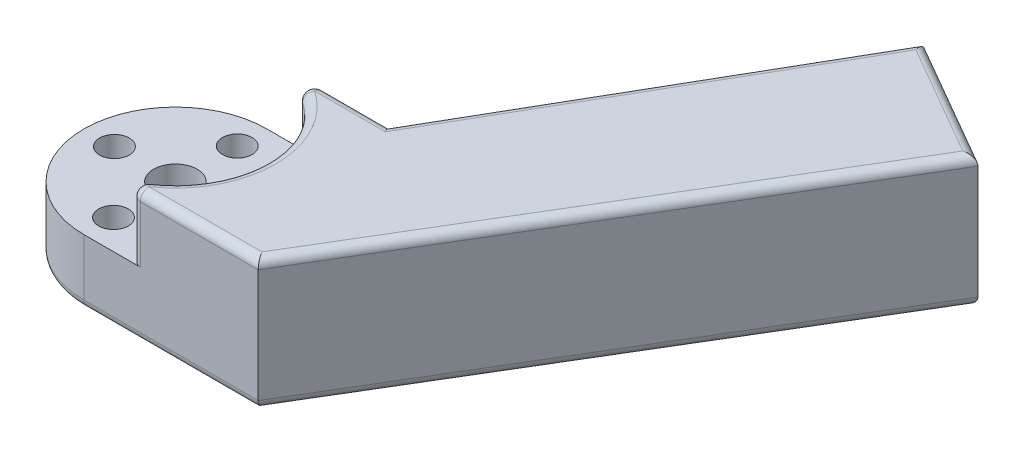
ISO-10303-21;
HEADER;
FILE_DESCRIPTION(('STEP AP214'),'2;1');
FILE_NAME('part.step','',(''),(''),'','','');
FILE_SCHEMA(('AUTOMOTIVE_DESIGN { 1 0 10303 214 1 1 1 1 }'));
ENDSEC;
DATA;
#1=APPLICATION_CONTEXT('core data for automotive mechanical design processes');
#2=APPLICATION_PROTOCOL_DEFINITION('international standard','automotive_design',2000,#1);
#3=PRODUCT_CONTEXT('',#1,'mechanical');
#4=PRODUCT('Part','Part','',(#3));
#5=PRODUCT_RELATED_PRODUCT_CATEGORY('part','',(#4));
#6=PRODUCT_DEFINITION_FORMATION('','',#4);
#7=PRODUCT_DEFINITION_CONTEXT('part definition',#1,'design');
#8=PRODUCT_DEFINITION('design','',#6,#7);
#9=PRODUCT_DEFINITION_SHAPE('','',#8);
#10=(LENGTH_UNIT() NAMED_UNIT(*) SI_UNIT(.MILLI.,.METRE.));
#11=(NAMED_UNIT(*) PLANE_ANGLE_UNIT() SI_UNIT($,.RADIAN.));
#12=(NAMED_UNIT(*) SI_UNIT($,.STERADIAN.) SOLID_ANGLE_UNIT());
#13=UNCERTAINTY_MEASURE_WITH_UNIT(LENGTH_MEASURE(1.E-05),#10,'distance_accuracy_value','');
#14=(GEOMETRIC_REPRESENTATION_CONTEXT(3) GLOBAL_UNCERTAINTY_ASSIGNED_CONTEXT((#13)) GLOBAL_UNIT_ASSIGNED_CONTEXT((#10,
#11,#12)) REPRESENTATION_CONTEXT('',''));
#15=CARTESIAN_POINT('',(0.,0.,0.));
#16=DIRECTION('',(0.,0.,1.));
#17=DIRECTION('',(1.,0.,0.));
#18=AXIS2_PLACEMENT_3D('',#15,#16,#17);
#19=CARTESIAN_POINT('',(0.,15.,0.));
#20=DIRECTION('',(0.,-1.,0.));
#21=DIRECTION('',(0.,0.,-1.));
#22=AXIS2_PLACEMENT_3D('',#19,#20,#21);
#23=CYLINDRICAL_SURFACE('',#22,10.5);
#24=DIRECTION('',(0.,-1.,0.));
#25=VECTOR('',#24,1.);
#26=CARTESIAN_POINT('',(5.91719802898109,15.,8.67391304347827));
#27=LINE('',#26,#25);
#28=CARTESIAN_POINT('',(5.91719802898109,7.5,8.67391304347826));
#29=VERTEX_POINT('',#28);
#30=CARTESIAN_POINT('',(5.91719802898109,14.,8.67391304347827));
#31=VERTEX_POINT('',#30);
#32=EDGE_CURVE('E398',#29,#31,#27,.F.);
#33=ORIENTED_EDGE('',*,*,#32,.T.);
#34=CARTESIAN_POINT('',(0.,14.,0.));
#35=DIRECTION('',(0.,1.,0.));
#36=DIRECTION('',(0.,0.,1.));
#37=AXIS2_PLACEMENT_3D('',#34,#35,#36);
#38=CIRCLE('',#37,10.5);
#39=CARTESIAN_POINT('',(5.91719802898109,14.,-8.67391304347827));
#40=VERTEX_POINT('',#39);
#41=EDGE_CURVE('E47',#31,#40,#38,.T.);
#42=ORIENTED_EDGE('',*,*,#41,.T.);
#43=DIRECTION('',(0.,-1.,0.));
#44=VECTOR('',#43,1.);
#45=CARTESIAN_POINT('',(5.91719802898109,15.,-8.67391304347827));
#46=LINE('',#45,#44);
#47=CARTESIAN_POINT('',(5.91719802898109,7.5,-8.67391304347826));
#48=VERTEX_POINT('',#47);
#49=EDGE_CURVE('E405',#40,#48,#46,.T.);
#50=ORIENTED_EDGE('',*,*,#49,.T.);
#51=CARTESIAN_POINT('',(0.,7.5,0.));
#52=DIRECTION('',(0.,1.,0.));
#53=DIRECTION('',(0.,0.,1.));
#54=AXIS2_PLACEMENT_3D('',#51,#52,#53);
#55=CIRCLE('',#54,10.5);
#56=EDGE_CURVE('E493',#29,#48,#55,.T.);
#57=ORIENTED_EDGE('',*,*,#56,.F.);
#58=EDGE_LOOP('',(#33,#42,#50,#57));
#59=FACE_BOUND('',#58,.T.);
#60=ADVANCED_FACE('F37',(#59),#23,.F.);
#61=CARTESIAN_POINT('',(0.,15.,10.5));
#62=DIRECTION('',(0.,0.,-1.));
#63=DIRECTION('',(-1.,0.,0.));
#64=AXIS2_PLACEMENT_3D('',#61,#62,#63);
#65=PLANE('',#64);
#66=DIRECTION('',(0.,-1.,0.));
#67=VECTOR('',#66,1.);
#68=CARTESIAN_POINT('',(0.,7.5,10.5));
#69=LINE('',#68,#67);
#70=CARTESIAN_POINT('',(0.,1.,10.5));
#71=VERTEX_POINT('',#70);
#72=CARTESIAN_POINT('',(0.,7.5,10.5));
#73=VERTEX_POINT('',#72);
#74=EDGE_CURVE('E84',#71,#73,#69,.F.);
#75=ORIENTED_EDGE('',*,*,#74,.F.);
#76=DIRECTION('',(1.,0.,0.));
#77=VECTOR('',#76,1.);
#78=CARTESIAN_POINT('',(0.,1.,10.5));
#79=LINE('',#78,#77);
#80=CARTESIAN_POINT('',(20.,1.,10.5));
#81=VERTEX_POINT('',#80);
#82=EDGE_CURVE('E463',#71,#81,#79,.T.);
#83=ORIENTED_EDGE('',*,*,#82,.T.);
#84=DIRECTION('',(0.,-1.,0.));
#85=VECTOR('',#84,1.);
#86=CARTESIAN_POINT('',(20.,15.,10.5));
#87=LINE('',#86,#85);
#88=CARTESIAN_POINT('',(20.,14.,10.5));
#89=VERTEX_POINT('',#88);
#90=EDGE_CURVE('E392',#89,#81,#87,.T.);
#91=ORIENTED_EDGE('',*,*,#90,.F.);
#92=DIRECTION('',(1.,0.,0.));
#93=VECTOR('',#92,1.);
#94=CARTESIAN_POINT('',(6.48074069840786,14.,10.5));
#95=LINE('',#94,#93);
#96=CARTESIAN_POINT('',(6.48074069840786,14.,10.5));
#97=VERTEX_POINT('',#96);
#98=EDGE_CURVE('E461',#89,#97,#95,.F.);
#99=ORIENTED_EDGE('',*,*,#98,.T.);
#100=DIRECTION('',(0.,1.,0.));
#101=VECTOR('',#100,1.);
#102=CARTESIAN_POINT('',(6.48074069840786,7.5,10.5));
#103=LINE('',#102,#101);
#104=CARTESIAN_POINT('',(6.48074069840786,7.5,10.5));
#105=VERTEX_POINT('',#104);
#106=EDGE_CURVE('E415',#97,#105,#103,.F.);
#107=ORIENTED_EDGE('',*,*,#106,.T.);
#108=DIRECTION('',(-1.,0.,0.));
#109=VECTOR('',#108,1.);
#110=CARTESIAN_POINT('',(0.,7.5,10.5));
#111=LINE('',#110,#109);
#112=EDGE_CURVE('E413',#105,#73,#111,.T.);
#113=ORIENTED_EDGE('',*,*,#112,.T.);
#114=EDGE_LOOP('',(#75,#83,#91,#99,#107,#113));
#115=FACE_BOUND('',#114,.T.);
#116=ADVANCED_FACE('F345',(#115),#65,.F.);
#117=CARTESIAN_POINT('',(19.3301904903682,15.,11.6147502239634));
#118=DIRECTION('',(0.85716730070211,0.,0.515038074910058));
#119=DIRECTION('',(0.515038074910058,0.,-0.85716730070211));
#120=AXIS2_PLACEMENT_3D('',#117,#118,#119);
#121=PLANE('',#120);
#122=ORIENTED_EDGE('',*,*,#90,.T.);
#123=DIRECTION('',(-0.515038074910058,0.,0.85716730070211));
#124=VECTOR('',#123,1.);
#125=CARTESIAN_POINT('',(51.0030782577631,1.,-41.0977870341021));
#126=LINE('',#125,#124);
#127=CARTESIAN_POINT('',(51.0030782577631,1.,-41.0977870341021));
#128=VERTEX_POINT('',#127);
#129=EDGE_CURVE('E372',#81,#128,#126,.F.);
#130=ORIENTED_EDGE('',*,*,#129,.T.);
#131=DIRECTION('',(0.,-1.,0.));
#132=VECTOR('',#131,1.);
#133=CARTESIAN_POINT('',(51.0030782577631,15.,-41.0977870341021));
#134=LINE('',#133,#132);
#135=CARTESIAN_POINT('',(51.0030782577631,14.,-41.0977870341021));
#136=VERTEX_POINT('',#135);
#137=EDGE_CURVE('E389',#136,#128,#134,.T.);
#138=ORIENTED_EDGE('',*,*,#137,.F.);
#139=DIRECTION('',(-0.515038074910058,0.,0.85716730070211));
#140=VECTOR('',#139,1.);
#141=CARTESIAN_POINT('',(19.3301904903682,14.,11.6147502239634));
#142=LINE('',#141,#140);
#143=EDGE_CURVE('E393',#136,#89,#142,.T.);
#144=ORIENTED_EDGE('',*,*,#143,.T.);
#145=EDGE_LOOP('',(#122,#130,#138,#144));
#146=FACE_BOUND('',#145,.T.);
#147=ADVANCED_FACE('F350',(#146),#121,.T.);
#148=CARTESIAN_POINT('',(30.5466333698682,15.,-52.9083209967909));
#149=DIRECTION('',(0.499999999999998,0.,-0.86602540378444));
#150=DIRECTION('',(-0.86602540378444,0.,-0.499999999999998));
#151=AXIS2_PLACEMENT_3D('',#148,#149,#150);
#152=PLANE('',#151);
#153=ORIENTED_EDGE('',*,*,#137,.T.);
#154=DIRECTION('',(0.86602540378444,0.,0.499999999999998));
#155=VECTOR('',#154,1.);
#156=CARTESIAN_POINT('',(36.4999999999999,1.,-49.4711431702998));
#157=LINE('',#156,#155);
#158=CARTESIAN_POINT('',(36.4999999999999,1.,-49.4711431702998));
#159=VERTEX_POINT('',#158);
#160=EDGE_CURVE('E378',#128,#159,#157,.F.);
#161=ORIENTED_EDGE('',*,*,#160,.T.);
#162=DIRECTION('',(0.,-1.,0.));
#163=VECTOR('',#162,1.);
#164=CARTESIAN_POINT('',(36.4999999999999,15.,-49.4711431702998));
#165=LINE('',#164,#163);
#166=CARTESIAN_POINT('',(36.4999999999999,14.,-49.4711431702998));
#167=VERTEX_POINT('',#166);
#168=EDGE_CURVE('E396',#167,#159,#165,.T.);
#169=ORIENTED_EDGE('',*,*,#168,.F.);
#170=DIRECTION('',(0.86602540378444,0.,0.499999999999998));
#171=VECTOR('',#170,1.);
#172=CARTESIAN_POINT('',(30.5466333698682,14.,-52.9083209967909));
#173=LINE('',#172,#171);
#174=EDGE_CURVE('E210',#167,#136,#173,.T.);
#175=ORIENTED_EDGE('',*,*,#174,.T.);
#176=EDGE_LOOP('',(#153,#161,#169,#175));
#177=FACE_BOUND('',#176,.T.);
#178=ADVANCED_FACE('F395',(#177),#152,.T.);
#179=CARTESIAN_POINT('',(5.95336663013174,15.,3.43717782649108));
#180=DIRECTION('',(-0.86602540378444,0.,-0.499999999999998));
#181=DIRECTION('',(-0.499999999999998,0.,0.86602540378444));
#182=AXIS2_PLACEMENT_3D('',#179,#180,#181);
#183=PLANE('',#182);
#184=ORIENTED_EDGE('',*,*,#168,.T.);
#185=DIRECTION('',(0.499999999999998,0.,-0.86602540378444));
#186=VECTOR('',#185,1.);
#187=CARTESIAN_POINT('',(14.,1.,-10.5));
#188=LINE('',#187,#186);
#189=CARTESIAN_POINT('',(14.,1.,-10.5));
#190=VERTEX_POINT('',#189);
#191=EDGE_CURVE('E453',#159,#190,#188,.F.);
#192=ORIENTED_EDGE('',*,*,#191,.T.);
#193=DIRECTION('',(0.,-1.,0.));
#194=VECTOR('',#193,1.);
#195=CARTESIAN_POINT('',(14.,15.,-10.5));
#196=LINE('',#195,#194);
#197=CARTESIAN_POINT('',(14.,14.,-10.5));
#198=VERTEX_POINT('',#197);
#199=EDGE_CURVE('E400',#198,#190,#196,.T.);
#200=ORIENTED_EDGE('',*,*,#199,.F.);
#201=DIRECTION('',(0.499999999999998,0.,-0.86602540378444));
#202=VECTOR('',#201,1.);
#203=CARTESIAN_POINT('',(5.95336663013174,14.,3.43717782649108));
#204=LINE('',#203,#202);
#205=EDGE_CURVE('E384',#198,#167,#204,.T.);
#206=ORIENTED_EDGE('',*,*,#205,.T.);
#207=EDGE_LOOP('',(#184,#192,#200,#206));
#208=FACE_BOUND('',#207,.T.);
#209=ADVANCED_FACE('F577',(#208),#183,.T.);
#210=CARTESIAN_POINT('',(0.,15.,-10.5));
#211=DIRECTION('',(0.,0.,-1.));
#212=DIRECTION('',(-1.,0.,0.));
#213=AXIS2_PLACEMENT_3D('',#210,#211,#212);
#214=PLANE('',#213);
#215=ORIENTED_EDGE('',*,*,#199,.T.);
#216=DIRECTION('',(1.,0.,0.));
#217=VECTOR('',#216,1.);
#218=CARTESIAN_POINT('',(0.,1.,-10.5));
#219=LINE('',#218,#217);
#220=CARTESIAN_POINT('',(0.,1.,-10.5));
#221=VERTEX_POINT('',#220);
#222=EDGE_CURVE('E457',#190,#221,#219,.F.);
#223=ORIENTED_EDGE('',*,*,#222,.T.);
#224=DIRECTION('',(0.,-1.,0.));
#225=VECTOR('',#224,1.);
#226=CARTESIAN_POINT('',(0.,7.5,-10.5));
#227=LINE('',#226,#225);
#228=CARTESIAN_POINT('',(0.,7.5,-10.5));
#229=VERTEX_POINT('',#228);
#230=EDGE_CURVE('E506',#221,#229,#227,.F.);
#231=ORIENTED_EDGE('',*,*,#230,.T.);
#232=DIRECTION('',(1.,0.,0.));
#233=VECTOR('',#232,1.);
#234=CARTESIAN_POINT('',(0.,7.5,-10.5));
#235=LINE('',#234,#233);
#236=CARTESIAN_POINT('',(6.48074069840786,7.5,-10.5));
#237=VERTEX_POINT('',#236);
#238=EDGE_CURVE('E410',#229,#237,#235,.T.);
#239=ORIENTED_EDGE('',*,*,#238,.T.);
#240=DIRECTION('',(0.,-1.,0.));
#241=VECTOR('',#240,1.);
#242=CARTESIAN_POINT('',(6.48074069840786,15.,-10.5));
#243=LINE('',#242,#241);
#244=CARTESIAN_POINT('',(6.48074069840786,14.,-10.5));
#245=VERTEX_POINT('',#244);
#246=EDGE_CURVE('E407',#237,#245,#243,.F.);
#247=ORIENTED_EDGE('',*,*,#246,.T.);
#248=DIRECTION('',(1.,0.,0.));
#249=VECTOR('',#248,1.);
#250=CARTESIAN_POINT('',(0.,14.,-10.5));
#251=LINE('',#250,#249);
#252=EDGE_CURVE('E455',#245,#198,#251,.T.);
#253=ORIENTED_EDGE('',*,*,#252,.T.);
#254=EDGE_LOOP('',(#215,#223,#231,#239,#247,#253));
#255=FACE_BOUND('',#254,.T.);
#256=ADVANCED_FACE('F502',(#255),#214,.T.);
#257=CARTESIAN_POINT('',(0.,15.,0.));
#258=DIRECTION('',(0.,1.,0.));
#259=DIRECTION('',(0.,0.,1.));
#260=AXIS2_PLACEMENT_3D('',#257,#258,#259);
#261=PLANE('',#260);
#262=DIRECTION('',(0.86602540378444,0.,0.499999999999998));
#263=VECTOR('',#262,1.);
#264=CARTESIAN_POINT('',(30.0466333698682,15.,-52.0422955930064));
#265=LINE('',#264,#263);
#266=CARTESIAN_POINT('',(49.6218044043704,15.,-40.7405653268037));
#267=VERTEX_POINT('',#266);
#268=CARTESIAN_POINT('',(36.8660254037843,15.,-48.1051177665154));
#269=VERTEX_POINT('',#268);
#270=EDGE_CURVE('E188',#267,#269,#265,.F.);
#271=ORIENTED_EDGE('',*,*,#270,.T.);
#272=DIRECTION('',(0.499999999999998,0.,-0.86602540378444));
#273=VECTOR('',#272,1.);
#274=CARTESIAN_POINT('',(6.81939203391618,15.,3.93717782649107));
#275=LINE('',#274,#273);
#276=CARTESIAN_POINT('',(14.5773502691896,15.,-9.5));
#277=VERTEX_POINT('',#276);
#278=EDGE_CURVE('E191',#269,#277,#275,.F.);
#279=ORIENTED_EDGE('',*,*,#278,.T.);
#280=DIRECTION('',(1.,0.,0.));
#281=VECTOR('',#280,1.);
#282=CARTESIAN_POINT('',(0.,15.,-9.5));
#283=LINE('',#282,#281);
#284=CARTESIAN_POINT('',(6.48074069840786,15.,-9.5));
#285=VERTEX_POINT('',#284);
#286=EDGE_CURVE('E480',#277,#285,#283,.F.);
#287=ORIENTED_EDGE('',*,*,#286,.T.);
#288=CARTESIAN_POINT('',(0.,15.,0.));
#289=DIRECTION('',(0.,1.,0.));
#290=DIRECTION('',(0.,0.,1.));
#291=AXIS2_PLACEMENT_3D('',#288,#289,#290);
#292=CIRCLE('',#291,11.5);
#293=CARTESIAN_POINT('',(6.48074069840786,15.,9.5));
#294=VERTEX_POINT('',#293);
#295=EDGE_CURVE('E482',#285,#294,#292,.F.);
#296=ORIENTED_EDGE('',*,*,#295,.T.);
#297=DIRECTION('',(1.,0.,0.));
#298=VECTOR('',#297,1.);
#299=CARTESIAN_POINT('',(20.,15.,9.5));
#300=LINE('',#299,#298);
#301=CARTESIAN_POINT('',(19.4342272218122,15.,9.5));
#302=VERTEX_POINT('',#301);
#303=EDGE_CURVE('E484',#294,#302,#300,.T.);
#304=ORIENTED_EDGE('',*,*,#303,.T.);
#305=DIRECTION('',(-0.515038074910058,0.,0.85716730070211));
#306=VECTOR('',#305,1.);
#307=CARTESIAN_POINT('',(18.4730231896661,15.,11.0997121490534));
#308=LINE('',#307,#306);
#309=EDGE_CURVE('E193',#302,#267,#308,.F.);
#310=ORIENTED_EDGE('',*,*,#309,.T.);
#311=EDGE_LOOP('',(#271,#279,#287,#296,#304,#310));
#312=FACE_BOUND('',#311,.T.);
#313=ADVANCED_FACE('F190',(#312),#261,.T.);
#314=CARTESIAN_POINT('',(0.,0.,0.));
#315=DIRECTION('',(0.,1.,0.));
#316=DIRECTION('',(0.,0.,1.));
#317=AXIS2_PLACEMENT_3D('',#314,#315,#316);
#318=PLANE('',#317);
#319=CARTESIAN_POINT('',(0.,0.,0.));
#320=DIRECTION('',(0.,1.,0.));
#321=DIRECTION('',(0.,0.,1.));
#322=AXIS2_PLACEMENT_3D('',#319,#320,#321);
#323=CIRCLE('',#322,3.5);
#324=CARTESIAN_POINT('',(0.,0.,3.5));
#325=VERTEX_POINT('',#324);
#326=EDGE_CURVE('E447',#325,#325,#323,.T.);
#327=ORIENTED_EDGE('',*,*,#326,.T.);
#328=EDGE_LOOP('',(#327));
#329=FACE_BOUND('',#328,.T.);
#330=CARTESIAN_POINT('',(7.2,0.,0.));
#331=DIRECTION('',(0.,1.,0.));
#332=DIRECTION('',(0.,0.,1.));
#333=AXIS2_PLACEMENT_3D('',#330,#331,#332);
#334=CIRCLE('',#333,2.7);
#335=CARTESIAN_POINT('',(7.2,0.,2.7));
#336=VERTEX_POINT('',#335);
#337=EDGE_CURVE('E444',#336,#336,#334,.T.);
#338=ORIENTED_EDGE('',*,*,#337,.T.);
#339=EDGE_LOOP('',(#338));
#340=FACE_BOUND('',#339,.T.);
#341=DIRECTION('',(1.,0.,0.));
#342=VECTOR('',#341,1.);
#343=CARTESIAN_POINT('',(0.,0.,9.5));
#344=LINE('',#343,#342);
#345=CARTESIAN_POINT('',(19.4342272218122,0.,9.5));
#346=VERTEX_POINT('',#345);
#347=CARTESIAN_POINT('',(1.2369316876853,0.,9.5));
#348=VERTEX_POINT('',#347);
#349=EDGE_CURVE('E438',#346,#348,#344,.F.);
#350=ORIENTED_EDGE('',*,*,#349,.T.);
#351=CARTESIAN_POINT('',(0.,0.,7.1));
#352=DIRECTION('',(0.,1.,0.));
#353=DIRECTION('',(0.,0.,1.));
#354=AXIS2_PLACEMENT_3D('',#351,#352,#353);
#355=CIRCLE('',#354,2.7);
#356=CARTESIAN_POINT('',(-1.426735362596,0.,9.39225352112677));
#357=VERTEX_POINT('',#356);
#358=EDGE_CURVE('E442',#348,#357,#355,.T.);
#359=ORIENTED_EDGE('',*,*,#358,.T.);
#360=CARTESIAN_POINT('',(0.,0.,0.));
#361=DIRECTION('',(0.,1.,0.));
#362=DIRECTION('',(0.,0.,1.));
#363=AXIS2_PLACEMENT_3D('',#360,#361,#362);
#364=CIRCLE('',#363,9.5);
#365=CARTESIAN_POINT('',(-9.42571428571429,0.,1.18571084336849));
#366=VERTEX_POINT('',#365);
#367=EDGE_CURVE('E440',#357,#366,#364,.F.);
#368=ORIENTED_EDGE('',*,*,#367,.T.);
#369=CARTESIAN_POINT('',(-7.,0.,0.));
#370=DIRECTION('',(0.,1.,0.));
#371=DIRECTION('',(0.,0.,1.));
#372=AXIS2_PLACEMENT_3D('',#369,#370,#371);
#373=CIRCLE('',#372,2.7);
#374=CARTESIAN_POINT('',(-7.,0.,2.7));
#375=VERTEX_POINT('',#374);
#376=EDGE_CURVE('E436',#366,#375,#373,.T.);
#377=ORIENTED_EDGE('',*,*,#376,.T.);
#378=CARTESIAN_POINT('',(-7.,0.,0.));
#379=DIRECTION('',(0.,1.,0.));
#380=DIRECTION('',(0.,0.,1.));
#381=AXIS2_PLACEMENT_3D('',#378,#379,#380);
#382=CIRCLE('',#381,2.7);
#383=CARTESIAN_POINT('',(-9.42571428571429,0.,-1.18571084336849));
#384=VERTEX_POINT('',#383);
#385=EDGE_CURVE('E434',#375,#384,#382,.T.);
#386=ORIENTED_EDGE('',*,*,#385,.T.);
#387=CARTESIAN_POINT('',(0.,0.,0.));
#388=DIRECTION('',(0.,1.,0.));
#389=DIRECTION('',(0.,0.,1.));
#390=AXIS2_PLACEMENT_3D('',#387,#388,#389);
#391=CIRCLE('',#390,9.5);
#392=CARTESIAN_POINT('',(-1.426735362596,0.,-9.39225352112676));
#393=VERTEX_POINT('',#392);
#394=EDGE_CURVE('E425',#384,#393,#391,.F.);
#395=ORIENTED_EDGE('',*,*,#394,.T.);
#396=CARTESIAN_POINT('',(0.,0.,-7.1));
#397=DIRECTION('',(0.,1.,0.));
#398=DIRECTION('',(0.,0.,1.));
#399=AXIS2_PLACEMENT_3D('',#396,#397,#398);
#400=CIRCLE('',#399,2.7);
#401=CARTESIAN_POINT('',(0.,0.,-4.4));
#402=VERTEX_POINT('',#401);
#403=EDGE_CURVE('E423',#393,#402,#400,.T.);
#404=ORIENTED_EDGE('',*,*,#403,.T.);
#405=CARTESIAN_POINT('',(0.,0.,-7.1));
#406=DIRECTION('',(0.,1.,0.));
#407=DIRECTION('',(0.,0.,1.));
#408=AXIS2_PLACEMENT_3D('',#405,#406,#407);
#409=CIRCLE('',#408,2.7);
#410=CARTESIAN_POINT('',(1.23693168768529,0.,-9.5));
#411=VERTEX_POINT('',#410);
#412=EDGE_CURVE('E421',#402,#411,#409,.T.);
#413=ORIENTED_EDGE('',*,*,#412,.T.);
#414=DIRECTION('',(1.,0.,0.));
#415=VECTOR('',#414,1.);
#416=CARTESIAN_POINT('',(14.,0.,-9.5));
#417=LINE('',#416,#415);
#418=CARTESIAN_POINT('',(14.5773502691896,0.,-9.5));
#419=VERTEX_POINT('',#418);
#420=EDGE_CURVE('E427',#411,#419,#417,.T.);
#421=ORIENTED_EDGE('',*,*,#420,.T.);
#422=DIRECTION('',(0.499999999999998,0.,-0.86602540378444));
#423=VECTOR('',#422,1.);
#424=CARTESIAN_POINT('',(37.3660254037843,0.,-48.9711431702998));
#425=LINE('',#424,#423);
#426=CARTESIAN_POINT('',(36.8660254037843,0.,-48.1051177665154));
#427=VERTEX_POINT('',#426);
#428=EDGE_CURVE('E429',#419,#427,#425,.T.);
#429=ORIENTED_EDGE('',*,*,#428,.T.);
#430=DIRECTION('',(0.86602540378444,0.,0.499999999999998));
#431=VECTOR('',#430,1.);
#432=CARTESIAN_POINT('',(50.5030782577631,0.,-40.2317616303176));
#433=LINE('',#432,#431);
#434=CARTESIAN_POINT('',(49.6218044043704,0.,-40.7405653268037));
#435=VERTEX_POINT('',#434);
#436=EDGE_CURVE('E431',#427,#435,#433,.T.);
#437=ORIENTED_EDGE('',*,*,#436,.T.);
#438=DIRECTION('',(-0.515038074910058,0.,0.85716730070211));
#439=VECTOR('',#438,1.);
#440=CARTESIAN_POINT('',(19.1428326992979,0.,9.98496192508994));
#441=LINE('',#440,#439);
#442=EDGE_CURVE('E374',#435,#346,#441,.T.);
#443=ORIENTED_EDGE('',*,*,#442,.T.);
#444=EDGE_LOOP('',(#350,#359,#368,#377,#386,#395,#404,#413,#421,#429,#437,#443));
#445=FACE_BOUND('',#444,.T.);
#446=ADVANCED_FACE('F569',(#329,#340,#445),#318,.F.);
#447=CARTESIAN_POINT('',(0.,7.5,0.));
#448=DIRECTION('',(0.,-1.,0.));
#449=DIRECTION('',(0.,0.,-1.));
#450=AXIS2_PLACEMENT_3D('',#447,#448,#449);
#451=CYLINDRICAL_SURFACE('',#450,10.5);
#452=ORIENTED_EDGE('',*,*,#230,.F.);
#453=CARTESIAN_POINT('',(0.,1.,0.));
#454=DIRECTION('',(0.,1.,0.));
#455=DIRECTION('',(0.,0.,1.));
#456=AXIS2_PLACEMENT_3D('',#453,#454,#455);
#457=CIRCLE('',#456,10.5);
#458=EDGE_CURVE('E459',#221,#71,#457,.T.);
#459=ORIENTED_EDGE('',*,*,#458,.T.);
#460=ORIENTED_EDGE('',*,*,#74,.T.);
#461=EDGE_CURVE('E510',#229,#73,#55,.T.);
#462=ORIENTED_EDGE('',*,*,#461,.F.);
#463=EDGE_LOOP('',(#452,#459,#460,#462));
#464=FACE_BOUND('',#463,.T.);
#465=ADVANCED_FACE('F511',(#464),#451,.T.);
#466=CARTESIAN_POINT('',(0.,7.5,0.));
#467=DIRECTION('',(0.,1.,0.));
#468=DIRECTION('',(0.,0.,1.));
#469=AXIS2_PLACEMENT_3D('',#466,#467,#468);
#470=PLANE('',#469);
#471=CARTESIAN_POINT('',(0.,7.5,-7.1));
#472=DIRECTION('',(0.,1.,0.));
#473=DIRECTION('',(0.,0.,1.));
#474=AXIS2_PLACEMENT_3D('',#471,#472,#473);
#475=CIRCLE('',#474,1.7);
#476=CARTESIAN_POINT('',(0.,7.5,-5.4));
#477=VERTEX_POINT('',#476);
#478=EDGE_CURVE('E515',#477,#477,#475,.T.);
#479=ORIENTED_EDGE('',*,*,#478,.F.);
#480=EDGE_LOOP('',(#479));
#481=FACE_BOUND('',#480,.T.);
#482=CARTESIAN_POINT('',(0.,7.5,7.1));
#483=DIRECTION('',(0.,1.,0.));
#484=DIRECTION('',(0.,0.,1.));
#485=AXIS2_PLACEMENT_3D('',#482,#483,#484);
#486=CIRCLE('',#485,1.7);
#487=CARTESIAN_POINT('',(0.,7.5,8.8));
#488=VERTEX_POINT('',#487);
#489=EDGE_CURVE('E536',#488,#488,#486,.T.);
#490=ORIENTED_EDGE('',*,*,#489,.F.);
#491=EDGE_LOOP('',(#490));
#492=FACE_BOUND('',#491,.T.);
#493=CARTESIAN_POINT('',(-7.,7.5,0.));
#494=DIRECTION('',(0.,1.,0.));
#495=DIRECTION('',(0.,0.,1.));
#496=AXIS2_PLACEMENT_3D('',#493,#494,#495);
#497=CIRCLE('',#496,1.7);
#498=CARTESIAN_POINT('',(-7.,7.5,1.7));
#499=VERTEX_POINT('',#498);
#500=EDGE_CURVE('E531',#499,#499,#497,.T.);
#501=ORIENTED_EDGE('',*,*,#500,.F.);
#502=EDGE_LOOP('',(#501));
#503=FACE_BOUND('',#502,.T.);
#504=CARTESIAN_POINT('',(7.2,7.5,0.));
#505=DIRECTION('',(0.,1.,0.));
#506=DIRECTION('',(0.,0.,1.));
#507=AXIS2_PLACEMENT_3D('',#504,#505,#506);
#508=CIRCLE('',#507,1.7);
#509=CARTESIAN_POINT('',(7.2,7.5,1.7));
#510=VERTEX_POINT('',#509);
#511=EDGE_CURVE('E529',#510,#510,#508,.T.);
#512=ORIENTED_EDGE('',*,*,#511,.F.);
#513=EDGE_LOOP('',(#512));
#514=FACE_BOUND('',#513,.T.);
#515=CARTESIAN_POINT('',(0.,7.5,0.));
#516=DIRECTION('',(0.,1.,0.));
#517=DIRECTION('',(0.,0.,1.));
#518=AXIS2_PLACEMENT_3D('',#515,#516,#517);
#519=CIRCLE('',#518,2.5);
#520=CARTESIAN_POINT('',(0.,7.5,2.5));
#521=VERTEX_POINT('',#520);
#522=EDGE_CURVE('E512',#521,#521,#519,.T.);
#523=ORIENTED_EDGE('',*,*,#522,.F.);
#524=EDGE_LOOP('',(#523));
#525=FACE_BOUND('',#524,.T.);
#526=ORIENTED_EDGE('',*,*,#461,.T.);
#527=ORIENTED_EDGE('',*,*,#112,.F.);
#528=CARTESIAN_POINT('',(6.48074069840786,7.5,9.5));
#529=DIRECTION('',(0.,1.,0.));
#530=DIRECTION('',(0.,0.,1.));
#531=AXIS2_PLACEMENT_3D('',#528,#529,#530);
#532=CIRCLE('',#531,1.);
#533=EDGE_CURVE('E419',#105,#29,#532,.F.);
#534=ORIENTED_EDGE('',*,*,#533,.T.);
#535=ORIENTED_EDGE('',*,*,#56,.T.);
#536=CARTESIAN_POINT('',(6.48074069840786,7.5,-9.5));
#537=DIRECTION('',(0.,1.,0.));
#538=DIRECTION('',(0.,0.,1.));
#539=AXIS2_PLACEMENT_3D('',#536,#537,#538);
#540=CIRCLE('',#539,1.);
#541=EDGE_CURVE('E417',#48,#237,#540,.F.);
#542=ORIENTED_EDGE('',*,*,#541,.T.);
#543=ORIENTED_EDGE('',*,*,#238,.F.);
#544=EDGE_LOOP('',(#526,#527,#534,#535,#542,#543));
#545=FACE_BOUND('',#544,.T.);
#546=ADVANCED_FACE('F359',(#481,#492,#503,#514,#525,#545),#470,.T.);
#547=CARTESIAN_POINT('',(6.48074069840786,15.,-9.5));
#548=DIRECTION('',(0.,-1.,0.));
#549=DIRECTION('',(0.,0.,-1.));
#550=AXIS2_PLACEMENT_3D('',#547,#548,#549);
#551=CYLINDRICAL_SURFACE('',#550,1.);
#552=ORIENTED_EDGE('',*,*,#49,.F.);
#553=CARTESIAN_POINT('',(6.48074069840786,14.,-9.5));
#554=DIRECTION('',(0.,-1.,0.));
#555=DIRECTION('',(0.,0.,-1.));
#556=AXIS2_PLACEMENT_3D('',#553,#554,#555);
#557=CIRCLE('',#556,1.);
#558=EDGE_CURVE('E11',#40,#245,#557,.T.);
#559=ORIENTED_EDGE('',*,*,#558,.T.);
#560=ORIENTED_EDGE('',*,*,#246,.F.);
#561=ORIENTED_EDGE('',*,*,#541,.F.);
#562=EDGE_LOOP('',(#552,#559,#560,#561));
#563=FACE_BOUND('',#562,.T.);
#564=ADVANCED_FACE('F355',(#563),#551,.T.);
#565=CARTESIAN_POINT('',(6.48074069840786,15.,9.5));
#566=DIRECTION('',(0.,-1.,0.));
#567=DIRECTION('',(0.,0.,-1.));
#568=AXIS2_PLACEMENT_3D('',#565,#566,#567);
#569=CYLINDRICAL_SURFACE('',#568,1.);
#570=ORIENTED_EDGE('',*,*,#106,.F.);
#571=CARTESIAN_POINT('',(6.48074069840786,14.,9.5));
#572=DIRECTION('',(0.,-1.,0.));
#573=DIRECTION('',(0.,0.,-1.));
#574=AXIS2_PLACEMENT_3D('',#571,#572,#573);
#575=CIRCLE('',#574,1.);
#576=EDGE_CURVE('E207',#97,#31,#575,.T.);
#577=ORIENTED_EDGE('',*,*,#576,.T.);
#578=ORIENTED_EDGE('',*,*,#32,.F.);
#579=ORIENTED_EDGE('',*,*,#533,.F.);
#580=EDGE_LOOP('',(#570,#577,#578,#579));
#581=FACE_BOUND('',#580,.T.);
#582=ADVANCED_FACE('F358',(#581),#569,.T.);
#583=CARTESIAN_POINT('',(0.,0.,0.));
#584=DIRECTION('',(0.,1.,0.));
#585=DIRECTION('',(0.,0.,1.));
#586=AXIS2_PLACEMENT_3D('',#583,#584,#585);
#587=CYLINDRICAL_SURFACE('',#586,2.5);
#588=CARTESIAN_POINT('',(0.,1.,0.));
#589=DIRECTION('',(0.,1.,0.));
#590=DIRECTION('',(0.,0.,1.));
#591=AXIS2_PLACEMENT_3D('',#588,#589,#590);
#592=CIRCLE('',#591,2.5);
#593=CARTESIAN_POINT('',(0.,1.,2.5));
#594=VERTEX_POINT('',#593);
#595=EDGE_CURVE('E465',#594,#594,#592,.F.);
#596=ORIENTED_EDGE('',*,*,#595,.T.);
#597=EDGE_LOOP('',(#596));
#598=FACE_BOUND('',#597,.T.);
#599=ORIENTED_EDGE('',*,*,#522,.T.);
#600=EDGE_LOOP('',(#599));
#601=FACE_BOUND('',#600,.T.);
#602=ADVANCED_FACE('F362',(#598,#601),#587,.F.);
#603=CARTESIAN_POINT('',(7.2,0.,0.));
#604=DIRECTION('',(0.,1.,0.));
#605=DIRECTION('',(0.,0.,1.));
#606=AXIS2_PLACEMENT_3D('',#603,#604,#605);
#607=CYLINDRICAL_SURFACE('',#606,1.7);
#608=CARTESIAN_POINT('',(7.2,1.,0.));
#609=DIRECTION('',(0.,1.,0.));
#610=DIRECTION('',(0.,0.,1.));
#611=AXIS2_PLACEMENT_3D('',#608,#609,#610);
#612=CIRCLE('',#611,1.7);
#613=CARTESIAN_POINT('',(7.2,1.,1.7));
#614=VERTEX_POINT('',#613);
#615=EDGE_CURVE('E468',#614,#614,#612,.F.);
#616=ORIENTED_EDGE('',*,*,#615,.T.);
#617=EDGE_LOOP('',(#616));
#618=FACE_BOUND('',#617,.T.);
#619=ORIENTED_EDGE('',*,*,#511,.T.);
#620=EDGE_LOOP('',(#619));
#621=FACE_BOUND('',#620,.T.);
#622=ADVANCED_FACE('F555',(#618,#621),#607,.F.);
#623=CARTESIAN_POINT('',(-7.,0.,0.));
#624=DIRECTION('',(0.,1.,0.));
#625=DIRECTION('',(0.,0.,1.));
#626=AXIS2_PLACEMENT_3D('',#623,#624,#625);
#627=CYLINDRICAL_SURFACE('',#626,1.7);
#628=CARTESIAN_POINT('',(-7.,1.,0.));
#629=DIRECTION('',(0.,1.,0.));
#630=DIRECTION('',(0.,0.,1.));
#631=AXIS2_PLACEMENT_3D('',#628,#629,#630);
#632=CIRCLE('',#631,1.7);
#633=CARTESIAN_POINT('',(-7.,1.,1.7));
#634=VERTEX_POINT('',#633);
#635=EDGE_CURVE('E471',#634,#634,#632,.F.);
#636=ORIENTED_EDGE('',*,*,#635,.T.);
#637=EDGE_LOOP('',(#636));
#638=FACE_BOUND('',#637,.T.);
#639=ORIENTED_EDGE('',*,*,#500,.T.);
#640=EDGE_LOOP('',(#639));
#641=FACE_BOUND('',#640,.T.);
#642=ADVANCED_FACE('F561',(#638,#641),#627,.F.);
#643=CARTESIAN_POINT('',(0.,0.,7.1));
#644=DIRECTION('',(0.,1.,0.));
#645=DIRECTION('',(0.,0.,1.));
#646=AXIS2_PLACEMENT_3D('',#643,#644,#645);
#647=CYLINDRICAL_SURFACE('',#646,1.7);
#648=CARTESIAN_POINT('',(0.,1.,7.1));
#649=DIRECTION('',(0.,1.,0.));
#650=DIRECTION('',(0.,0.,1.));
#651=AXIS2_PLACEMENT_3D('',#648,#649,#650);
#652=CIRCLE('',#651,1.7);
#653=CARTESIAN_POINT('',(0.,1.,8.8));
#654=VERTEX_POINT('',#653);
#655=EDGE_CURVE('E474',#654,#654,#652,.F.);
#656=ORIENTED_EDGE('',*,*,#655,.T.);
#657=EDGE_LOOP('',(#656));
#658=FACE_BOUND('',#657,.T.);
#659=ORIENTED_EDGE('',*,*,#489,.T.);
#660=EDGE_LOOP('',(#659));
#661=FACE_BOUND('',#660,.T.);
#662=ADVANCED_FACE('F543',(#658,#661),#647,.F.);
#663=CARTESIAN_POINT('',(0.,0.,-7.1));
#664=DIRECTION('',(0.,1.,0.));
#665=DIRECTION('',(0.,0.,1.));
#666=AXIS2_PLACEMENT_3D('',#663,#664,#665);
#667=CYLINDRICAL_SURFACE('',#666,1.7);
#668=CARTESIAN_POINT('',(0.,1.,-7.1));
#669=DIRECTION('',(0.,1.,0.));
#670=DIRECTION('',(0.,0.,1.));
#671=AXIS2_PLACEMENT_3D('',#668,#669,#670);
#672=CIRCLE('',#671,1.7);
#673=CARTESIAN_POINT('',(0.,1.,-5.4));
#674=VERTEX_POINT('',#673);
#675=EDGE_CURVE('E477',#674,#674,#672,.F.);
#676=ORIENTED_EDGE('',*,*,#675,.T.);
#677=EDGE_LOOP('',(#676));
#678=FACE_BOUND('',#677,.T.);
#679=ORIENTED_EDGE('',*,*,#478,.T.);
#680=EDGE_LOOP('',(#679));
#681=FACE_BOUND('',#680,.T.);
#682=ADVANCED_FACE('F650',(#678,#681),#667,.F.);
#683=CARTESIAN_POINT('',(-7.,1.,0.));
#684=DIRECTION('',(0.,1.,0.));
#685=DIRECTION('',(0.,0.,1.));
#686=AXIS2_PLACEMENT_3D('',#683,#684,#685);
#687=TOROIDAL_SURFACE('',#686,2.7,1.);
#688=ORIENTED_EDGE('',*,*,#635,.F.);
#689=EDGE_LOOP('',(#688));
#690=FACE_BOUND('',#689,.T.);
#691=ORIENTED_EDGE('',*,*,#385,.F.);
#692=ORIENTED_EDGE('',*,*,#376,.F.);
#693=CARTESIAN_POINT('',(-9.42571428571429,0.,-1.18571084336849));
#694=CARTESIAN_POINT('',(-9.42677367004423,9.23224772458515E-09,-1.18215946570751));
#695=CARTESIAN_POINT('',(-9.42782843151688,5.6287321504477E-07,-1.17860664725741));
#696=CARTESIAN_POINT('',(-9.4619304420595,3.5806084510276E-05,-1.06318598747334));
#697=CARTESIAN_POINT('',(-9.49039615613415,0.000596607167344211,-0.949906085339717));
#698=CARTESIAN_POINT('',(-9.53775106770174,0.00197533045128137,-0.721303185648277));
#699=CARTESIAN_POINT('',(-9.55663325440732,0.00279344017881744,-0.605978756068242));
#700=CARTESIAN_POINT('',(-9.58456164578636,0.00412908357724822,-0.373896756757007));
#701=CARTESIAN_POINT('',(-9.59358820454426,0.00464601593753052,-0.257136792015374));
#702=CARTESIAN_POINT('',(-9.6016047781034,0.00510383706487622,-0.0233307090338901));
#703=CARTESIAN_POINT('',(-9.60059896083834,0.00504496504909464,0.0937152701781491));
#704=CARTESIAN_POINT('',(-9.58616391518338,0.00422944488750656,0.373939126792653));
#705=CARTESIAN_POINT('',(-9.56793686232731,0.00320369995639747,0.536885683053529));
#706=CARTESIAN_POINT('',(-9.51239826257325,0.00111348943341214,0.859171322868347));
#707=CARTESIAN_POINT('',(-9.47512787404742,4.91119280250543E-05,1.01851741570737));
#708=CARTESIAN_POINT('',(-9.42782843115661,5.70439053990609E-07,1.17860666966508));
#709=CARTESIAN_POINT('',(-9.42677366978115,1.70090855312876E-08,1.18215948811422));
#710=CARTESIAN_POINT('',(-9.42571428571429,0.,1.18571084336849));
#711=B_SPLINE_CURVE_WITH_KNOTS('',3,(#693,#694,#695,#696,#697,#698,#699,#700,#701,#702,#703,
#704,#705,#706,#707,#708,#709,#710),.UNSPECIFIED.,.F.,.F.,(4,2,2,2,2,2,2,2,4),(0.,
0.0111182296149242,0.361053691759461,0.711244780006514,1.06213266145705,1.41287477320243,
1.90359348828889,2.39325607095082,2.40437430056685),.UNSPECIFIED.);
#712=EDGE_CURVE('E288',#384,#366,#711,.T.);
#713=ORIENTED_EDGE('',*,*,#712,.F.);
#714=EDGE_LOOP('',(#691,#692,#713));
#715=FACE_BOUND('',#714,.T.);
#716=ADVANCED_FACE('F298',(#690,#715),#687,.T.);
#717=CARTESIAN_POINT('',(0.,1.,-7.1));
#718=DIRECTION('',(0.,1.,0.));
#719=DIRECTION('',(0.,0.,1.));
#720=AXIS2_PLACEMENT_3D('',#717,#718,#719);
#721=TOROIDAL_SURFACE('',#720,2.7,1.);
#722=ORIENTED_EDGE('',*,*,#675,.F.);
#723=EDGE_LOOP('',(#722));
#724=FACE_BOUND('',#723,.T.);
#725=CARTESIAN_POINT('',(1.23693168768529,0.,-9.5));
#726=CARTESIAN_POINT('',(1.23390475333078,8.83357056416063E-09,-9.50073414287493));
#727=CARTESIAN_POINT('',(1.23087717913583,8.16760205097795E-07,-9.50146574247619));
#728=CARTESIAN_POINT('',(1.12777775116265,5.50118818965071E-05,-9.5262873030981));
#729=CARTESIAN_POINT('',(1.02701302136977,0.000963657461013459,-9.54759804946439));
#730=CARTESIAN_POINT('',(0.824404478591534,0.00339532290759103,-9.58437515530514));
#731=CARTESIAN_POINT('',(0.722560275513085,0.00491857279727174,-9.59983932243298));
#732=CARTESIAN_POINT('',(0.517416993071814,0.00773614087314953,-9.62479091249187));
#733=CARTESIAN_POINT('',(0.414112726768631,0.0090288201428227,-9.63423668744928));
#734=CARTESIAN_POINT('',(0.258885626994525,0.0103731347551119,-9.64369198708741));
#735=CARTESIAN_POINT('',(0.207099226167224,0.0107221211668307,-9.64605819296445));
#736=CARTESIAN_POINT('',(0.103476395825107,0.0111943061755899,-9.64921351248419));
#737=CARTESIAN_POINT('',(0.0516399653444686,0.0113175003228048,-9.65000259504558));
#738=CARTESIAN_POINT('',(-0.000200000000001323,0.0113140027407735,-9.64999999607843));
#739=B_SPLINE_CURVE_WITH_KNOTS('',3,(#725,#726,#727,#728,#729,#730,#731,#732,#733,#734,#735,
#736,#737,#738),.UNSPECIFIED.,.F.,.F.,(4,2,2,2,2,2,4),(0.,0.00934413680299297,0.318133616898613,
0.627038772108439,0.938059012106538,1.09356264824418,1.24906934895364),.UNSPECIFIED.);
#740=CARTESIAN_POINT('',(0.,0.0113140033357404,-9.65));
#741=VERTEX_POINT('',#740);
#742=EDGE_CURVE('E75',#411,#741,#739,.T.);
#743=ORIENTED_EDGE('',*,*,#742,.F.);
#744=ORIENTED_EDGE('',*,*,#412,.F.);
#745=ORIENTED_EDGE('',*,*,#403,.F.);
#746=CARTESIAN_POINT('',(0.000199999999999182,0.0113140028979928,-9.64999999504216));
#747=CARTESIAN_POINT('',(-0.0605730373718159,0.0113175026510061,-9.65000363324909));
#748=CARTESIAN_POINT('',(-0.121337125900986,0.0111928670076803,-9.64863232021804));
#749=CARTESIAN_POINT('',(-0.242739603243606,0.0107155058012271,-9.64315027964318));
#750=CARTESIAN_POINT('',(-0.303377994435487,0.010362784594171,-9.63903960441679));
#751=CARTESIAN_POINT('',(-0.484964903972342,0.00900461604619881,-9.62261251484069));
#752=CARTESIAN_POINT('',(-0.605566522526482,0.00769917992036893,-9.60620104174836));
#753=CARTESIAN_POINT('',(-0.843013788378737,0.00487441654625594,-9.56305541089973));
#754=CARTESIAN_POINT('',(-0.959888625934654,0.00335856774388324,-9.53647877515127));
#755=CARTESIAN_POINT('',(-1.19086537627775,0.000946756697159706,-9.47340059205305));
#756=CARTESIAN_POINT('',(-1.30496949632076,5.02842837120156E-05,-9.43690724752449));
#757=CARTESIAN_POINT('',(-1.42044010949577,6.92498569323812E-07,-9.39457404469));
#758=CARTESIAN_POINT('',(-1.42358844211436,6.79038761820144E-09,-9.39341562191672));
#759=CARTESIAN_POINT('',(-1.426735362596,0.,-9.39225352112677));
#760=B_SPLINE_CURVE_WITH_KNOTS('',3,(#746,#747,#748,#749,#750,#751,#752,#753,#754,#755,#756,
#757,#758,#759),.UNSPECIFIED.,.F.,.F.,(4,2,2,2,2,2,4),(0.,0.182285610640695,0.364567740019126,
0.729187700247833,1.08837244568218,1.44726098330971,1.45732504060709),.UNSPECIFIED.);
#761=EDGE_CURVE('E784',#741,#393,#760,.T.);
#762=ORIENTED_EDGE('',*,*,#761,.F.);
#763=EDGE_LOOP('',(#743,#744,#745,#762));
#764=FACE_BOUND('',#763,.T.);
#765=ADVANCED_FACE('F310',(#724,#764),#721,.T.);
#766=CARTESIAN_POINT('',(0.,1.,-9.5));
#767=DIRECTION('',(-1.,0.,0.));
#768=DIRECTION('',(0.,0.,1.));
#769=AXIS2_PLACEMENT_3D('',#766,#767,#768);
#770=CYLINDRICAL_SURFACE('',#769,1.);
#771=CARTESIAN_POINT('',(0.,1.,-9.5));
#772=DIRECTION('',(-1.,0.,0.));
#773=DIRECTION('',(0.,0.,1.));
#774=AXIS2_PLACEMENT_3D('',#771,#772,#773);
#775=CIRCLE('',#774,1.);
#776=EDGE_CURVE('E526',#221,#741,#775,.T.);
#777=ORIENTED_EDGE('',*,*,#776,.F.);
#778=ORIENTED_EDGE('',*,*,#222,.F.);
#779=CARTESIAN_POINT('',(14.5773502691896,1.,-9.50000000000001));
#780=DIRECTION('',(-0.866025403784438,0.,0.500000000000001));
#781=DIRECTION('',(0.500000000000001,0.,0.866025403784438));
#782=AXIS2_PLACEMENT_3D('',#779,#780,#781);
#783=ELLIPSE('',#782,1.15470053837925,1.);
#784=EDGE_CURVE('E287',#419,#190,#783,.F.);
#785=ORIENTED_EDGE('',*,*,#784,.F.);
#786=ORIENTED_EDGE('',*,*,#420,.F.);
#787=ORIENTED_EDGE('',*,*,#742,.T.);
#788=EDGE_LOOP('',(#777,#778,#785,#786,#787));
#789=FACE_BOUND('',#788,.T.);
#790=ADVANCED_FACE('F304',(#789),#770,.T.);
#791=CARTESIAN_POINT('',(6.81939203391618,1.,3.93717782649107));
#792=DIRECTION('',(-0.499999999999998,0.,0.86602540378444));
#793=DIRECTION('',(0.86602540378444,0.,0.499999999999998));
#794=AXIS2_PLACEMENT_3D('',#791,#792,#793);
#795=CYLINDRICAL_SURFACE('',#794,1.);
#796=ORIENTED_EDGE('',*,*,#784,.T.);
#797=ORIENTED_EDGE('',*,*,#191,.F.);
#798=CARTESIAN_POINT('',(36.8660254037843,1.,-48.1051177665154));
#799=DIRECTION('',(-0.965925826289068,0.,0.258819045102523));
#800=DIRECTION('',(0.258819045102523,0.,0.965925826289068));
#801=AXIS2_PLACEMENT_3D('',#798,#799,#800);
#802=ELLIPSE('',#801,1.4142135623731,1.);
#803=EDGE_CURVE('E266',#427,#159,#802,.F.);
#804=ORIENTED_EDGE('',*,*,#803,.F.);
#805=ORIENTED_EDGE('',*,*,#428,.F.);
#806=EDGE_LOOP('',(#796,#797,#804,#805));
#807=FACE_BOUND('',#806,.T.);
#808=ADVANCED_FACE('F275',(#807),#795,.T.);
#809=CARTESIAN_POINT('',(0.,1.,7.1));
#810=DIRECTION('',(0.,1.,0.));
#811=DIRECTION('',(0.,0.,1.));
#812=AXIS2_PLACEMENT_3D('',#809,#810,#811);
#813=TOROIDAL_SURFACE('',#812,2.7,1.);
#814=ORIENTED_EDGE('',*,*,#655,.F.);
#815=EDGE_LOOP('',(#814));
#816=FACE_BOUND('',#815,.T.);
#817=CARTESIAN_POINT('',(-1.426735362596,0.,9.39225352112676));
#818=CARTESIAN_POINT('',(-1.42358844211436,6.79038763685408E-09,9.39341562191674));
#819=CARTESIAN_POINT('',(-1.42044010949577,6.92498569269649E-07,9.39457404469005));
#820=CARTESIAN_POINT('',(-1.30496949632112,5.02842837093792E-05,9.43690724752528));
#821=CARTESIAN_POINT('',(-1.190865376278,0.000946756697157501,9.47340059205321));
#822=CARTESIAN_POINT('',(-0.959888625934885,0.00335856774388001,9.53647877515098));
#823=CARTESIAN_POINT('',(-0.843013788379074,0.00487441654625154,9.56305541089959));
#824=CARTESIAN_POINT('',(-0.605566522526762,0.00769917992036609,9.60620104174838));
#825=CARTESIAN_POINT('',(-0.484964903972455,0.00900461604619834,9.62261251484069));
#826=CARTESIAN_POINT('',(-0.303377994435445,0.0103627845941714,9.63903960441679));
#827=CARTESIAN_POINT('',(-0.242739603243569,0.0107155058012272,9.64315027964318));
#828=CARTESIAN_POINT('',(-0.121337125900965,0.0111928670076801,9.64863232021804));
#829=CARTESIAN_POINT('',(-0.0605730373718067,0.0113175026510059,9.6500036332491));
#830=CARTESIAN_POINT('',(0.000199999999999475,0.0113140028979928,9.64999999504216));
#831=B_SPLINE_CURVE_WITH_KNOTS('',3,(#817,#818,#819,#820,#821,#822,#823,#824,#825,#826,#827,
#828,#829,#830),.UNSPECIFIED.,.F.,.F.,(4,2,2,2,2,2,4),(0.,0.0100640572974061,0.368952594924644,
0.728137340358848,1.09275730058801,1.27503942996643,1.45732504060709),.UNSPECIFIED.);
#832=CARTESIAN_POINT('',(0.,0.01131400333574,9.65));
#833=VERTEX_POINT('',#832);
#834=EDGE_CURVE('E67',#357,#833,#831,.T.);
#835=ORIENTED_EDGE('',*,*,#834,.F.);
#836=ORIENTED_EDGE('',*,*,#358,.F.);
#837=CARTESIAN_POINT('',(-0.000200000000000911,0.0113140027407742,9.64999999607843));
#838=CARTESIAN_POINT('',(0.0516399653218627,0.0113175003223237,9.65000259506979));
#839=CARTESIAN_POINT('',(0.103476395771182,0.0111943061754859,9.64921351249715));
#840=CARTESIAN_POINT('',(0.207099226071488,0.010722121167618,9.64605819295602));
#841=CARTESIAN_POINT('',(0.258885626888276,0.0103731347563232,9.6436919870682));
#842=CARTESIAN_POINT('',(0.414112727083814,0.0090288201395075,9.63423668748142));
#843=CARTESIAN_POINT('',(0.517416993843692,0.00773614085951131,9.62479091266991));
#844=CARTESIAN_POINT('',(0.722560276447952,0.00491857278742927,9.59983932204918));
#845=CARTESIAN_POINT('',(0.82440447923809,0.00339532291299257,9.5843751542514));
#846=CARTESIAN_POINT('',(1.02701302205499,0.000963657439869967,9.54759805027524));
#847=CARTESIAN_POINT('',(1.12777775217604,5.5011818121255E-05,9.52628730645055));
#848=CARTESIAN_POINT('',(1.23087717913704,8.16756337176083E-07,9.50146574269112));
#849=CARTESIAN_POINT('',(1.23390475333203,8.83155476311453E-09,9.50073414298507));
#850=CARTESIAN_POINT('',(1.2369316876853,0.,9.5));
#851=B_SPLINE_CURVE_WITH_KNOTS('',3,(#837,#838,#839,#840,#841,#842,#843,#844,#845,#846,#847,
#848,#849,#850),.UNSPECIFIED.,.F.,.F.,(4,2,2,2,2,2,4),(0.,0.155506700624224,0.311010336738894,
0.622030577973539,0.930935732804036,1.23972521208555,1.24906934896249),.UNSPECIFIED.);
#852=EDGE_CURVE('E257',#833,#348,#851,.T.);
#853=ORIENTED_EDGE('',*,*,#852,.F.);
#854=EDGE_LOOP('',(#835,#836,#853));
#855=FACE_BOUND('',#854,.T.);
#856=ADVANCED_FACE('F270',(#816,#855),#813,.T.);
#857=CARTESIAN_POINT('',(0.,1.,0.));
#858=DIRECTION('',(0.,1.,0.));
#859=DIRECTION('',(0.,0.,1.));
#860=AXIS2_PLACEMENT_3D('',#857,#858,#859);
#861=TOROIDAL_SURFACE('',#860,9.5,1.);
#862=ORIENTED_EDGE('',*,*,#367,.F.);
#863=ORIENTED_EDGE('',*,*,#834,.T.);
#864=CARTESIAN_POINT('',(0.,1.,9.5));
#865=DIRECTION('',(1.,0.,0.));
#866=DIRECTION('',(0.,0.,-1.));
#867=AXIS2_PLACEMENT_3D('',#864,#865,#866);
#868=CIRCLE('',#867,1.);
#869=EDGE_CURVE('E251',#71,#833,#868,.T.);
#870=ORIENTED_EDGE('',*,*,#869,.F.);
#871=ORIENTED_EDGE('',*,*,#458,.F.);
#872=ORIENTED_EDGE('',*,*,#776,.T.);
#873=ORIENTED_EDGE('',*,*,#761,.T.);
#874=ORIENTED_EDGE('',*,*,#394,.F.);
#875=ORIENTED_EDGE('',*,*,#712,.T.);
#876=EDGE_LOOP('',(#862,#863,#870,#871,#872,#873,#874,#875));
#877=FACE_BOUND('',#876,.T.);
#878=ADVANCED_FACE('F274',(#877),#861,.T.);
#879=CARTESIAN_POINT('',(30.0466333698682,1.,-52.0422955930064));
#880=DIRECTION('',(-0.86602540378444,0.,-0.499999999999998));
#881=DIRECTION('',(-0.499999999999998,0.,0.86602540378444));
#882=AXIS2_PLACEMENT_3D('',#879,#880,#881);
#883=CYLINDRICAL_SURFACE('',#882,1.);
#884=ORIENTED_EDGE('',*,*,#803,.T.);
#885=ORIENTED_EDGE('',*,*,#160,.F.);
#886=CARTESIAN_POINT('',(49.6218044043704,1.,-40.7405653268037));
#887=DIRECTION('',(-0.25038000405444,0.,-0.968147640378108));
#888=DIRECTION('',(-0.968147640378108,0.,0.25038000405444));
#889=AXIS2_PLACEMENT_3D('',#886,#887,#888);
#890=ELLIPSE('',#889,1.42671819439984,1.);
#891=EDGE_CURVE('E244',#435,#128,#890,.F.);
#892=ORIENTED_EDGE('',*,*,#891,.F.);
#893=ORIENTED_EDGE('',*,*,#436,.F.);
#894=EDGE_LOOP('',(#884,#885,#892,#893));
#895=FACE_BOUND('',#894,.T.);
#896=ADVANCED_FACE('F302',(#895),#883,.T.);
#897=CARTESIAN_POINT('',(0.,1.,9.5));
#898=DIRECTION('',(1.,0.,0.));
#899=DIRECTION('',(0.,0.,-1.));
#900=AXIS2_PLACEMENT_3D('',#897,#898,#899);
#901=CYLINDRICAL_SURFACE('',#900,1.);
#902=ORIENTED_EDGE('',*,*,#852,.T.);
#903=ORIENTED_EDGE('',*,*,#349,.F.);
#904=CARTESIAN_POINT('',(19.4342272218122,1.,9.5));
#905=DIRECTION('',(0.870355695939901,0.,-0.492423560103465));
#906=DIRECTION('',(0.492423560103465,0.,0.870355695939901));
#907=AXIS2_PLACEMENT_3D('',#904,#905,#906);
#908=ELLIPSE('',#907,1.14895554158475,1.);
#909=EDGE_CURVE('E240',#81,#346,#908,.T.);
#910=ORIENTED_EDGE('',*,*,#909,.F.);
#911=ORIENTED_EDGE('',*,*,#82,.F.);
#912=ORIENTED_EDGE('',*,*,#869,.T.);
#913=EDGE_LOOP('',(#902,#903,#910,#911,#912));
#914=FACE_BOUND('',#913,.T.);
#915=ADVANCED_FACE('F277',(#914),#901,.T.);
#916=CARTESIAN_POINT('',(18.4730231896661,1.,11.0997121490534));
#917=DIRECTION('',(0.515038074910058,0.,-0.85716730070211));
#918=DIRECTION('',(-0.85716730070211,0.,-0.515038074910058));
#919=AXIS2_PLACEMENT_3D('',#916,#917,#918);
#920=CYLINDRICAL_SURFACE('',#919,1.);
#921=ORIENTED_EDGE('',*,*,#891,.T.);
#922=ORIENTED_EDGE('',*,*,#129,.F.);
#923=ORIENTED_EDGE('',*,*,#909,.T.);
#924=ORIENTED_EDGE('',*,*,#442,.F.);
#925=EDGE_LOOP('',(#921,#922,#923,#924));
#926=FACE_BOUND('',#925,.T.);
#927=ADVANCED_FACE('F315',(#926),#920,.T.);
#928=CARTESIAN_POINT('',(0.,1.,0.));
#929=DIRECTION('',(0.,1.,0.));
#930=DIRECTION('',(0.,0.,1.));
#931=AXIS2_PLACEMENT_3D('',#928,#929,#930);
#932=TOROIDAL_SURFACE('',#931,3.5,1.);
#933=ORIENTED_EDGE('',*,*,#595,.F.);
#934=EDGE_LOOP('',(#933));
#935=FACE_BOUND('',#934,.T.);
#936=ORIENTED_EDGE('',*,*,#326,.F.);
#937=EDGE_LOOP('',(#936));
#938=FACE_BOUND('',#937,.T.);
#939=ADVANCED_FACE('F311',(#935,#938),#932,.T.);
#940=CARTESIAN_POINT('',(7.2,1.,0.));
#941=DIRECTION('',(0.,1.,0.));
#942=DIRECTION('',(0.,0.,1.));
#943=AXIS2_PLACEMENT_3D('',#940,#941,#942);
#944=TOROIDAL_SURFACE('',#943,2.7,1.);
#945=ORIENTED_EDGE('',*,*,#615,.F.);
#946=EDGE_LOOP('',(#945));
#947=FACE_BOUND('',#946,.T.);
#948=ORIENTED_EDGE('',*,*,#337,.F.);
#949=EDGE_LOOP('',(#948));
#950=FACE_BOUND('',#949,.T.);
#951=ADVANCED_FACE('F314',(#947,#950),#944,.T.);
#952=CARTESIAN_POINT('',(6.48074069840786,14.,9.5));
#953=DIRECTION('',(0.,1.,0.));
#954=DIRECTION('',(0.,0.,1.));
#955=AXIS2_PLACEMENT_3D('',#952,#953,#954);
#956=SPHERICAL_SURFACE('',#955,1.);
#957=CARTESIAN_POINT('',(6.48074069840786,14.,9.5));
#958=DIRECTION('',(1.,0.,0.));
#959=DIRECTION('',(0.,0.,-1.));
#960=AXIS2_PLACEMENT_3D('',#957,#958,#959);
#961=CIRCLE('',#960,1.);
#962=EDGE_CURVE('E233',#294,#97,#961,.T.);
#963=ORIENTED_EDGE('',*,*,#962,.F.);
#964=CARTESIAN_POINT('',(6.48074069840786,14.,9.5));
#965=DIRECTION('',(0.82608695652174,0.,-0.563542669426769));
#966=DIRECTION('',(-0.563542669426769,0.,-0.82608695652174));
#967=AXIS2_PLACEMENT_3D('',#964,#965,#966);
#968=CIRCLE('',#967,1.);
#969=EDGE_CURVE('E41',#31,#294,#968,.T.);
#970=ORIENTED_EDGE('',*,*,#969,.F.);
#971=ORIENTED_EDGE('',*,*,#576,.F.);
#972=EDGE_LOOP('',(#963,#970,#971));
#973=FACE_BOUND('',#972,.T.);
#974=ADVANCED_FACE('F39',(#973),#956,.T.);
#975=CARTESIAN_POINT('',(0.,14.,0.));
#976=DIRECTION('',(0.,1.,0.));
#977=DIRECTION('',(0.,0.,1.));
#978=AXIS2_PLACEMENT_3D('',#975,#976,#977);
#979=TOROIDAL_SURFACE('',#978,11.5,1.);
#980=ORIENTED_EDGE('',*,*,#969,.T.);
#981=ORIENTED_EDGE('',*,*,#295,.F.);
#982=CARTESIAN_POINT('',(6.48074069840786,14.,-9.5));
#983=DIRECTION('',(-0.826086956521739,0.,-0.563542669426771));
#984=DIRECTION('',(-0.563542669426771,0.,0.826086956521739));
#985=AXIS2_PLACEMENT_3D('',#982,#983,#984);
#986=CIRCLE('',#985,1.);
#987=EDGE_CURVE('E231',#40,#285,#986,.T.);
#988=ORIENTED_EDGE('',*,*,#987,.F.);
#989=ORIENTED_EDGE('',*,*,#41,.F.);
#990=EDGE_LOOP('',(#980,#981,#988,#989));
#991=FACE_BOUND('',#990,.T.);
#992=ADVANCED_FACE('F338',(#991),#979,.T.);
#993=CARTESIAN_POINT('',(0.,14.,9.5));
#994=DIRECTION('',(-1.,0.,0.));
#995=DIRECTION('',(0.,0.,1.));
#996=AXIS2_PLACEMENT_3D('',#993,#994,#995);
#997=CYLINDRICAL_SURFACE('',#996,1.);
#998=ORIENTED_EDGE('',*,*,#962,.T.);
#999=ORIENTED_EDGE('',*,*,#98,.F.);
#1000=CARTESIAN_POINT('',(19.4342272218122,14.,9.5));
#1001=DIRECTION('',(-0.870355695939901,0.,0.492423560103465));
#1002=DIRECTION('',(-0.492423560103465,0.,-0.870355695939901));
#1003=AXIS2_PLACEMENT_3D('',#1000,#1001,#1002);
#1004=ELLIPSE('',#1003,1.14895554158475,1.);
#1005=EDGE_CURVE('E228',#302,#89,#1004,.F.);
#1006=ORIENTED_EDGE('',*,*,#1005,.F.);
#1007=ORIENTED_EDGE('',*,*,#303,.F.);
#1008=EDGE_LOOP('',(#998,#999,#1006,#1007));
#1009=FACE_BOUND('',#1008,.T.);
#1010=ADVANCED_FACE('F335',(#1009),#997,.T.);
#1011=CARTESIAN_POINT('',(6.48074069840786,14.,-9.5));
#1012=DIRECTION('',(0.,1.,0.));
#1013=DIRECTION('',(0.,0.,1.));
#1014=AXIS2_PLACEMENT_3D('',#1011,#1012,#1013);
#1015=SPHERICAL_SURFACE('',#1014,1.);
#1016=ORIENTED_EDGE('',*,*,#558,.F.);
#1017=ORIENTED_EDGE('',*,*,#987,.T.);
#1018=CARTESIAN_POINT('',(6.48074069840786,14.,-9.5));
#1019=DIRECTION('',(1.,0.,0.));
#1020=DIRECTION('',(0.,0.,-1.));
#1021=AXIS2_PLACEMENT_3D('',#1018,#1019,#1020);
#1022=CIRCLE('',#1021,1.);
#1023=EDGE_CURVE('E225',#245,#285,#1022,.T.);
#1024=ORIENTED_EDGE('',*,*,#1023,.F.);
#1025=EDGE_LOOP('',(#1016,#1017,#1024));
#1026=FACE_BOUND('',#1025,.T.);
#1027=ADVANCED_FACE('F331',(#1026),#1015,.T.);
#1028=CARTESIAN_POINT('',(18.4730231896661,14.,11.0997121490534));
#1029=DIRECTION('',(-0.515038074910058,0.,0.85716730070211));
#1030=DIRECTION('',(0.85716730070211,0.,0.515038074910058));
#1031=AXIS2_PLACEMENT_3D('',#1028,#1029,#1030);
#1032=CYLINDRICAL_SURFACE('',#1031,1.);
#1033=ORIENTED_EDGE('',*,*,#1005,.T.);
#1034=ORIENTED_EDGE('',*,*,#143,.F.);
#1035=CARTESIAN_POINT('',(49.6218044043704,14.,-40.7405653268037));
#1036=DIRECTION('',(0.25038000405444,0.,0.968147640378108));
#1037=DIRECTION('',(-0.968147640378108,0.,0.25038000405444));
#1038=AXIS2_PLACEMENT_3D('',#1035,#1036,#1037);
#1039=ELLIPSE('',#1038,1.42671819439984,1.);
#1040=EDGE_CURVE('E213',#267,#136,#1039,.F.);
#1041=ORIENTED_EDGE('',*,*,#1040,.F.);
#1042=ORIENTED_EDGE('',*,*,#309,.F.);
#1043=EDGE_LOOP('',(#1033,#1034,#1041,#1042));
#1044=FACE_BOUND('',#1043,.T.);
#1045=ADVANCED_FACE('F327',(#1044),#1032,.T.);
#1046=CARTESIAN_POINT('',(0.,14.,-9.5));
#1047=DIRECTION('',(1.,0.,0.));
#1048=DIRECTION('',(0.,0.,-1.));
#1049=AXIS2_PLACEMENT_3D('',#1046,#1047,#1048);
#1050=CYLINDRICAL_SURFACE('',#1049,1.);
#1051=ORIENTED_EDGE('',*,*,#1023,.T.);
#1052=ORIENTED_EDGE('',*,*,#286,.F.);
#1053=CARTESIAN_POINT('',(14.5773502691896,14.,-9.50000000000001));
#1054=DIRECTION('',(0.866025403784438,0.,-0.500000000000001));
#1055=DIRECTION('',(-0.500000000000001,0.,-0.866025403784438));
#1056=AXIS2_PLACEMENT_3D('',#1053,#1054,#1055);
#1057=ELLIPSE('',#1056,1.15470053837925,1.);
#1058=EDGE_CURVE('E205',#198,#277,#1057,.T.);
#1059=ORIENTED_EDGE('',*,*,#1058,.F.);
#1060=ORIENTED_EDGE('',*,*,#252,.F.);
#1061=EDGE_LOOP('',(#1051,#1052,#1059,#1060));
#1062=FACE_BOUND('',#1061,.T.);
#1063=ADVANCED_FACE('F324',(#1062),#1050,.T.);
#1064=CARTESIAN_POINT('',(30.0466333698682,14.,-52.0422955930064));
#1065=DIRECTION('',(0.86602540378444,0.,0.499999999999998));
#1066=DIRECTION('',(0.499999999999998,0.,-0.86602540378444));
#1067=AXIS2_PLACEMENT_3D('',#1064,#1065,#1066);
#1068=CYLINDRICAL_SURFACE('',#1067,1.);
#1069=ORIENTED_EDGE('',*,*,#1040,.T.);
#1070=ORIENTED_EDGE('',*,*,#174,.F.);
#1071=CARTESIAN_POINT('',(36.8660254037843,14.,-48.1051177665154));
#1072=DIRECTION('',(0.965925826289068,0.,-0.258819045102523));
#1073=DIRECTION('',(0.258819045102523,0.,0.965925826289068));
#1074=AXIS2_PLACEMENT_3D('',#1071,#1072,#1073);
#1075=ELLIPSE('',#1074,1.4142135623731,1.);
#1076=EDGE_CURVE('E202',#269,#167,#1075,.F.);
#1077=ORIENTED_EDGE('',*,*,#1076,.F.);
#1078=ORIENTED_EDGE('',*,*,#270,.F.);
#1079=EDGE_LOOP('',(#1069,#1070,#1077,#1078));
#1080=FACE_BOUND('',#1079,.T.);
#1081=ADVANCED_FACE('F209',(#1080),#1068,.T.);
#1082=CARTESIAN_POINT('',(6.81939203391618,14.,3.93717782649107));
#1083=DIRECTION('',(0.499999999999998,0.,-0.86602540378444));
#1084=DIRECTION('',(-0.86602540378444,0.,-0.499999999999998));
#1085=AXIS2_PLACEMENT_3D('',#1082,#1083,#1084);
#1086=CYLINDRICAL_SURFACE('',#1085,1.);
#1087=ORIENTED_EDGE('',*,*,#1058,.T.);
#1088=ORIENTED_EDGE('',*,*,#278,.F.);
#1089=ORIENTED_EDGE('',*,*,#1076,.T.);
#1090=ORIENTED_EDGE('',*,*,#205,.F.);
#1091=EDGE_LOOP('',(#1087,#1088,#1089,#1090));
#1092=FACE_BOUND('',#1091,.T.);
#1093=ADVANCED_FACE('F200',(#1092),#1086,.T.);
#1094=CLOSED_SHELL('',(#60,#116,#147,#178,#209,#256,#313,#446,#465,#546,#564,#582,#602,#622,
#642,#662,#682,#716,#765,#790,#808,#856,#878,#896,#915,#927,#939,#951,#974,#992,#1010,#1027,
#1045,#1063,#1081,#1093));
#1095=MANIFOLD_SOLID_BREP('B2',#1094);
#1096=ADVANCED_BREP_SHAPE_REPRESENTATION('',(#18,#1095),#14);
#1097=SHAPE_DEFINITION_REPRESENTATION(#9,#1096);
ENDSEC;
END-ISO-10303-21;
